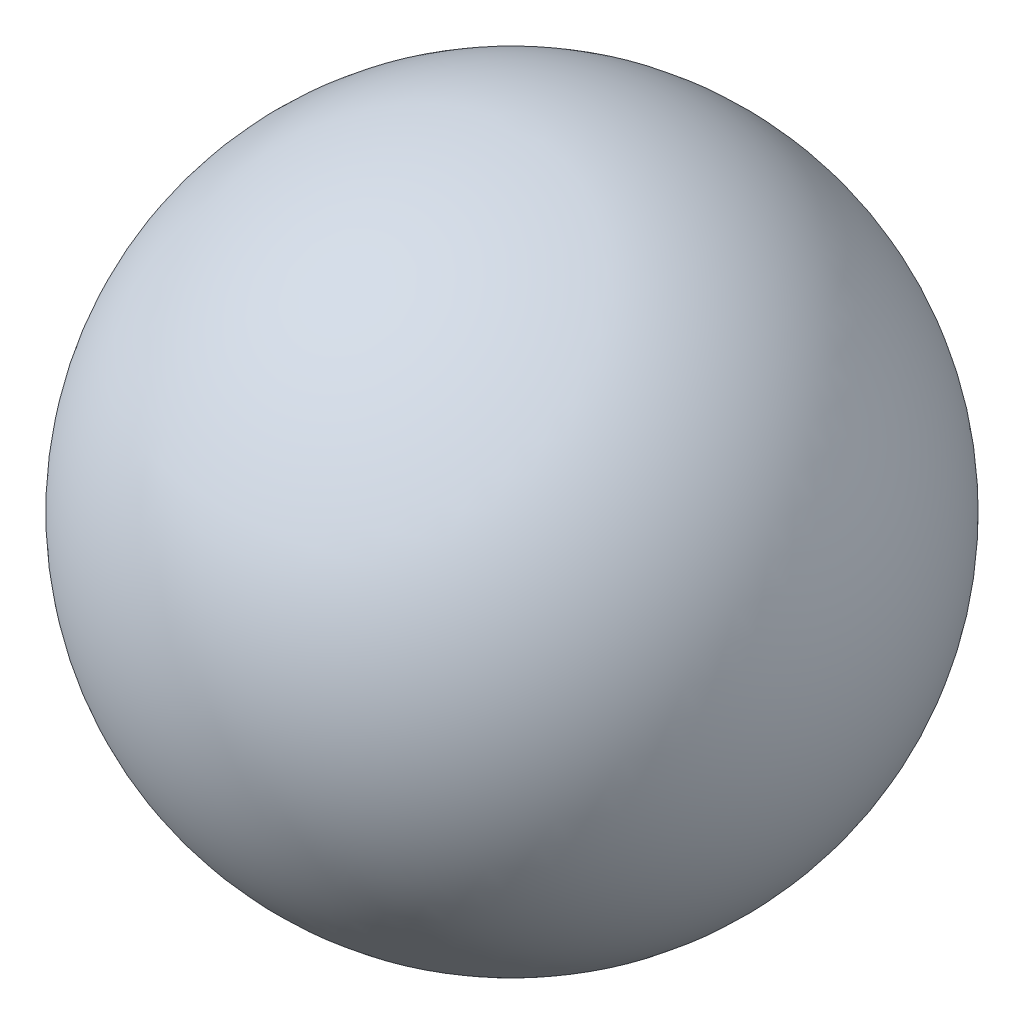
ISO-10303-21;
HEADER;
FILE_DESCRIPTION(('STEP AP214'),'2;1');
FILE_NAME('part.step','',(''),(''),'','','');
FILE_SCHEMA(('AUTOMOTIVE_DESIGN { 1 0 10303 214 1 1 1 1 }'));
ENDSEC;
DATA;
#1=APPLICATION_CONTEXT('core data for automotive mechanical design processes');
#2=APPLICATION_PROTOCOL_DEFINITION('international standard','automotive_design',2000,#1);
#3=PRODUCT_CONTEXT('',#1,'mechanical');
#4=PRODUCT('Part','Part','',(#3));
#5=PRODUCT_RELATED_PRODUCT_CATEGORY('part','',(#4));
#6=PRODUCT_DEFINITION_FORMATION('','',#4);
#7=PRODUCT_DEFINITION_CONTEXT('part definition',#1,'design');
#8=PRODUCT_DEFINITION('design','',#6,#7);
#9=PRODUCT_DEFINITION_SHAPE('','',#8);
#10=(LENGTH_UNIT() NAMED_UNIT(*) SI_UNIT(.MILLI.,.METRE.));
#11=(NAMED_UNIT(*) PLANE_ANGLE_UNIT() SI_UNIT($,.RADIAN.));
#12=(NAMED_UNIT(*) SI_UNIT($,.STERADIAN.) SOLID_ANGLE_UNIT());
#13=UNCERTAINTY_MEASURE_WITH_UNIT(LENGTH_MEASURE(1.E-05),#10,'distance_accuracy_value','');
#14=(GEOMETRIC_REPRESENTATION_CONTEXT(3) GLOBAL_UNCERTAINTY_ASSIGNED_CONTEXT((#13)) GLOBAL_UNIT_ASSIGNED_CONTEXT((#10,
#11,#12)) REPRESENTATION_CONTEXT('',''));
#15=CARTESIAN_POINT('',(0.,0.,0.));
#16=DIRECTION('',(0.,0.,1.));
#17=DIRECTION('',(1.,0.,0.));
#18=AXIS2_PLACEMENT_3D('',#15,#16,#17);
#19=CARTESIAN_POINT('',(0.,60.,0.));
#20=DIRECTION('',(0.,-1.,0.));
#21=DIRECTION('',(-1.,0.,0.));
#22=AXIS2_PLACEMENT_3D('',#19,#20,#21);
#23=SPHERICAL_SURFACE('',#22,60.);
#24=CARTESIAN_POINT('',(0.,0.,0.));
#25=VERTEX_POINT('',#24);
#26=VERTEX_LOOP('',#25);
#27=FACE_BOUND('',#26,.T.);
#28=ADVANCED_FACE('F30',(#27),#23,.T.);
#29=CLOSED_SHELL('',(#28));
#30=MANIFOLD_SOLID_BREP('B2',#29);
#31=ADVANCED_BREP_SHAPE_REPRESENTATION('',(#18,#30),#14);
#32=SHAPE_DEFINITION_REPRESENTATION(#9,#31);
ENDSEC;
END-ISO-10303-21;
